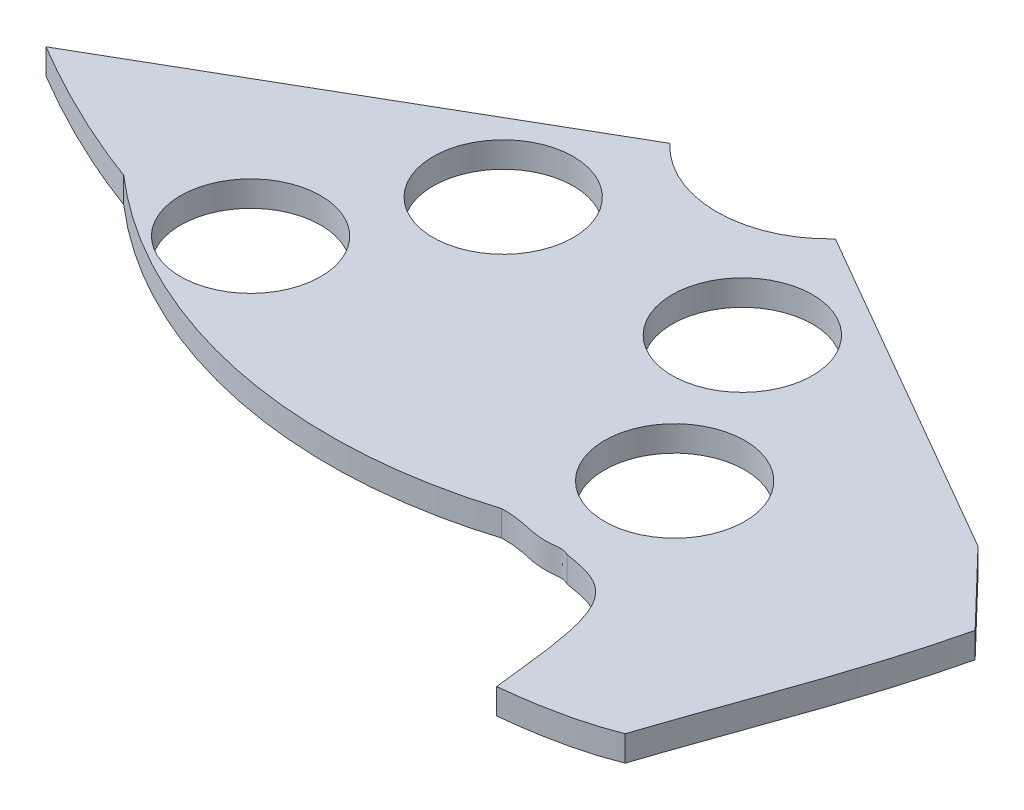
ISO-10303-21;
HEADER;
FILE_DESCRIPTION(('STEP AP214'),'2;1');
FILE_NAME('part.step','',(''),(''),'','','');
FILE_SCHEMA(('AUTOMOTIVE_DESIGN { 1 0 10303 214 1 1 1 1 }'));
ENDSEC;
DATA;
#1=APPLICATION_CONTEXT('core data for automotive mechanical design processes');
#2=APPLICATION_PROTOCOL_DEFINITION('international standard','automotive_design',2000,#1);
#3=PRODUCT_CONTEXT('',#1,'mechanical');
#4=PRODUCT('Part','Part','',(#3));
#5=PRODUCT_RELATED_PRODUCT_CATEGORY('part','',(#4));
#6=PRODUCT_DEFINITION_FORMATION('','',#4);
#7=PRODUCT_DEFINITION_CONTEXT('part definition',#1,'design');
#8=PRODUCT_DEFINITION('design','',#6,#7);
#9=PRODUCT_DEFINITION_SHAPE('','',#8);
#10=(LENGTH_UNIT() NAMED_UNIT(*) SI_UNIT(.MILLI.,.METRE.));
#11=(NAMED_UNIT(*) PLANE_ANGLE_UNIT() SI_UNIT($,.RADIAN.));
#12=(NAMED_UNIT(*) SI_UNIT($,.STERADIAN.) SOLID_ANGLE_UNIT());
#13=UNCERTAINTY_MEASURE_WITH_UNIT(LENGTH_MEASURE(1.E-05),#10,'distance_accuracy_value','');
#14=(GEOMETRIC_REPRESENTATION_CONTEXT(3) GLOBAL_UNCERTAINTY_ASSIGNED_CONTEXT((#13)) GLOBAL_UNIT_ASSIGNED_CONTEXT((#10,
#11,#12)) REPRESENTATION_CONTEXT('',''));
#15=CARTESIAN_POINT('',(0.,0.,0.));
#16=DIRECTION('',(0.,0.,1.));
#17=DIRECTION('',(1.,0.,0.));
#18=AXIS2_PLACEMENT_3D('',#15,#16,#17);
#19=CARTESIAN_POINT('',(0.,-43.7359999999999,0.));
#20=DIRECTION('',(0.,-1.,0.));
#21=DIRECTION('',(0.,0.,-1.));
#22=AXIS2_PLACEMENT_3D('',#19,#20,#21);
#23=PLANE('',#22);
#24=CARTESIAN_POINT('',(18.75,-43.7359999999999,32.476));
#25=DIRECTION('',(0.,-1.,0.));
#26=DIRECTION('',(0.,0.,-1.));
#27=AXIS2_PLACEMENT_3D('',#24,#25,#26);
#28=CIRCLE('',#27,10.999845998306);
#29=CARTESIAN_POINT('',(18.75,-43.7359999999999,21.476154001694));
#30=VERTEX_POINT('',#29);
#31=EDGE_CURVE('E395',#30,#30,#28,.T.);
#32=ORIENTED_EDGE('',*,*,#31,.F.);
#33=EDGE_LOOP('',(#32));
#34=FACE_BOUND('',#33,.T.);
#35=CARTESIAN_POINT('',(-33.25,-43.7359999999999,57.591));
#36=DIRECTION('',(0.,-1.,0.));
#37=DIRECTION('',(0.,0.,-1.));
#38=AXIS2_PLACEMENT_3D('',#35,#36,#37);
#39=CIRCLE('',#38,10.999845998306);
#40=CARTESIAN_POINT('',(-33.25,-43.7359999999999,46.591154001694));
#41=VERTEX_POINT('',#40);
#42=EDGE_CURVE('E184',#41,#41,#39,.T.);
#43=ORIENTED_EDGE('',*,*,#42,.F.);
#44=EDGE_LOOP('',(#43));
#45=FACE_BOUND('',#44,.T.);
#46=CARTESIAN_POINT('',(0.,-43.7359999999999,0.));
#47=DIRECTION('',(0.,1.,0.));
#48=DIRECTION('',(0.,0.,-1.));
#49=AXIS2_PLACEMENT_3D('',#46,#47,#48);
#50=CIRCLE('',#49,17.7501305084715);
#51=CARTESIAN_POINT('',(-12.9766531358799,-43.7359999999999,12.1108879302399));
#52=VERTEX_POINT('',#51);
#53=CARTESIAN_POINT('',(12.9766531358511,-43.7359999999999,12.1108879302707));
#54=VERTEX_POINT('',#53);
#55=EDGE_CURVE('E382',#52,#54,#50,.T.);
#56=ORIENTED_EDGE('',*,*,#55,.T.);
#57=DIRECTION('',(0.866025113442762,0.,0.500000502886197));
#58=VECTOR('',#57,1.);
#59=CARTESIAN_POINT('',(12.9766531358511,-43.7359999999999,12.1108879302707));
#60=LINE('',#59,#58);
#61=CARTESIAN_POINT('',(65.8946490574716,-43.7359999999999,42.6631480920527));
#62=VERTEX_POINT('',#61);
#63=EDGE_CURVE('E99',#54,#62,#60,.T.);
#64=ORIENTED_EDGE('',*,*,#63,.T.);
#65=DIRECTION('',(0.693108334501433,0.,0.720833431969307));
#66=VECTOR('',#65,1.);
#67=CARTESIAN_POINT('',(65.8946490574716,-43.7359999999999,42.6631480920527));
#68=LINE('',#67,#66);
#69=CARTESIAN_POINT('',(77.0984048569557,-43.7359999999999,54.3150664746204));
#70=VERTEX_POINT('',#69);
#71=EDGE_CURVE('E376',#62,#70,#68,.T.);
#72=ORIENTED_EDGE('',*,*,#71,.T.);
#73=CARTESIAN_POINT('',(63.7069100064156,-43.7359999999999,95.7945524473434));
#74=CARTESIAN_POINT('',(64.015107612092,-43.7359999999999,94.8574661245503));
#75=CARTESIAN_POINT('',(64.6302710481504,-43.7359999999999,92.9870387377193));
#76=CARTESIAN_POINT('',(65.7081083485375,-43.7359999999999,89.8467531430533));
#77=CARTESIAN_POINT('',(66.9234172120382,-43.7359999999999,86.3862466294311));
#78=CARTESIAN_POINT('',(68.7339451101139,-43.7359999999999,81.299646281765));
#79=CARTESIAN_POINT('',(70.973500177216,-43.7359999999999,74.9803086793586));
#80=CARTESIAN_POINT('',(73.1008593021126,-43.7359999999999,68.6072949940735));
#81=CARTESIAN_POINT('',(74.6646595645997,-43.7359999999999,63.5032415774842));
#82=CARTESIAN_POINT('',(75.4987469677565,-43.7359999999999,60.5708213525043));
#83=CARTESIAN_POINT('',(76.0346970582517,-43.7359999999999,58.5741590522036));
#84=CARTESIAN_POINT('',(76.3126412633934,-43.7359999999999,57.5107075403805));
#85=CARTESIAN_POINT('',(76.5828114238156,-43.7359999999999,56.4464599434171));
#86=CARTESIAN_POINT('',(76.8456969776299,-43.7359999999999,55.3815868382954));
#87=CARTESIAN_POINT('',(77.0141989671998,-43.7359999999999,54.6704463559508));
#88=CARTESIAN_POINT('',(77.0984048569557,-43.7359999999999,54.3150664746204));
#89=B_SPLINE_CURVE_WITH_KNOTS('',3,(#73,#74,#75,#76,#77,#78,#79,#80,#81,#82,#83,#84,#85,#86,#87,
#88),.UNSPECIFIED.,.F.,.F.,(4,1,1,1,1,1,1,1,1,1,1,1,1,4),(0.,0.0678624264260967,
0.135453626668924,0.228399086259461,0.320178258423042,0.506887549948629,0.689623560844155,
0.782324482215271,0.874107435390033,0.899339348726902,0.924544740953175,0.949723388572744,
0.974875152453978,1.),.UNSPECIFIED.);
#90=CARTESIAN_POINT('',(63.7069100063629,-43.7359999999999,95.7945524473647));
#91=VERTEX_POINT('',#90);
#92=EDGE_CURVE('E261',#70,#91,#89,.F.);
#93=ORIENTED_EDGE('',*,*,#92,.T.);
#94=CARTESIAN_POINT('',(-878.9098124133,-43.7359999999999,-1666.19623544953));
#95=CARTESIAN_POINT('',(1253.73109242407,-43.7359999999999,1934.69867430787));
#96=CARTESIAN_POINT('',(-1017.51914521483,-43.7359999999999,-1797.32532520752));
#97=CARTESIAN_POINT('',(226.982326293528,-43.7359999999999,2054.37229430913));
#98=B_SPLINE_CURVE_WITH_KNOTS('',3,(#94,#95,#96,#97),.UNSPECIFIED.,.F.,.F.,(4,4),
(-15.3310318488955,21.0495799457119),.UNSPECIFIED.);
#99=CARTESIAN_POINT('',(47.2193607498537,-43.7359999999999,99.4676209764198));
#100=VERTEX_POINT('',#99);
#101=EDGE_CURVE('E257',#91,#100,#98,.T.);
#102=ORIENTED_EDGE('',*,*,#101,.T.);
#103=CARTESIAN_POINT('',(34.7613348490512,-43.7359999999999,76.0169271980795));
#104=CARTESIAN_POINT('',(35.0281057972164,-43.7359999999999,76.0543747060179));
#105=CARTESIAN_POINT('',(35.7061558254564,-43.7359999999999,76.1540447682622));
#106=CARTESIAN_POINT('',(36.7442002754335,-43.7359999999999,76.3347608072393));
#107=CARTESIAN_POINT('',(37.914484612396,-43.7359999999999,76.5966844103583));
#108=CARTESIAN_POINT('',(39.0266307741556,-43.7359999999999,76.9320880805245));
#109=CARTESIAN_POINT('',(40.130080769675,-43.7359999999999,77.3933604653864));
#110=CARTESIAN_POINT('',(41.1420644497732,-43.7359999999999,77.987120956502));
#111=CARTESIAN_POINT('',(42.0521871249464,-43.7359999999999,78.7358646406187));
#112=CARTESIAN_POINT('',(42.8337549280017,-43.7359999999999,79.6206387973766));
#113=CARTESIAN_POINT('',(43.4752967929125,-43.7359999999999,80.5945227262676));
#114=CARTESIAN_POINT('',(44.0156145895162,-43.7359999999999,81.6597507216393));
#115=CARTESIAN_POINT('',(44.5984939154484,-43.7359999999999,83.1102141014957));
#116=CARTESIAN_POINT('',(45.1475423889094,-43.7359999999999,84.9887489422292));
#117=CARTESIAN_POINT('',(45.631650409809,-43.7359999999999,87.2480359791229));
#118=CARTESIAN_POINT('',(46.0146669762717,-43.7359999999999,89.5214778155936));
#119=CARTESIAN_POINT('',(46.3255569316779,-43.7359999999999,91.7311363169831));
#120=CARTESIAN_POINT('',(46.6100223162015,-43.7359999999999,94.0205069777494));
#121=CARTESIAN_POINT('',(46.8734678088274,-43.7359999999999,96.313603012262));
#122=CARTESIAN_POINT('',(47.078814588451,-43.7359999999999,98.1789577369324));
#123=CARTESIAN_POINT('',(47.1908123385781,-43.7359999999999,99.2058615104236));
#124=CARTESIAN_POINT('',(47.2193607498537,-43.7359999999999,99.4676209764198));
#125=B_SPLINE_CURVE_WITH_KNOTS('',3,(#103,#104,#105,#106,#107,#108,#109,#110,#111,#112,#113,
#114,#115,#116,#117,#118,#119,#120,#121,#122,#123,#124),.UNSPECIFIED.,.F.,.F.,(4,1,1,1,1,1,1,1,
1,1,1,1,1,1,1,1,1,1,1,4),(0.,0.0255150972310009,0.064910698530786,0.0997702289098735,
0.139050770842425,0.174778284912275,0.212810271676901,0.249753080614974,0.285920016532127,
0.3242135902118,0.359890863091441,0.398887197886508,0.472121187593369,0.544915101377225,
0.617655893238202,0.690440729915689,0.756254769905276,0.836160594182994,0.909062389474332,
0.93400243649382),.UNSPECIFIED.);
#126=CARTESIAN_POINT('',(34.7613348490562,-43.7359999999999,76.0169271980802));
#127=VERTEX_POINT('',#126);
#128=EDGE_CURVE('E260',#100,#127,#125,.F.);
#129=ORIENTED_EDGE('',*,*,#128,.T.);
#130=CARTESIAN_POINT('',(23.4360137790917,-43.7359999999999,74.920133487089));
#131=CARTESIAN_POINT('',(23.5289220972387,-43.7359999999999,74.9171179384482));
#132=CARTESIAN_POINT('',(23.7031334177712,-43.7359999999999,74.9114635178176));
#133=CARTESIAN_POINT('',(24.0745660087652,-43.7359999999999,74.9067751371668));
#134=CARTESIAN_POINT('',(24.746410223038,-43.7359999999999,74.9166710575145));
#135=CARTESIAN_POINT('',(25.7293670437363,-43.7359999999999,74.9931287989677));
#136=CARTESIAN_POINT('',(26.7027297891214,-43.7359999999999,75.1507404125561));
#137=CARTESIAN_POINT('',(27.4770255049856,-43.7359999999999,75.3067964759693));
#138=CARTESIAN_POINT('',(28.2510283346333,-43.7359999999999,75.4716797149084));
#139=CARTESIAN_POINT('',(29.2205562389775,-43.7359999999999,75.6704454421777));
#140=CARTESIAN_POINT('',(30.3976353608172,-43.7359999999999,75.8242359044292));
#141=CARTESIAN_POINT('',(31.3861905119862,-43.7359999999999,75.8486681276571));
#142=CARTESIAN_POINT('',(32.0580687542244,-43.7359999999999,75.8116987684063));
#143=CARTESIAN_POINT('',(33.1015648406731,-43.7359999999999,75.7177235764243));
#144=CARTESIAN_POINT('',(33.9376122073635,-43.7359999999999,75.5350653444208));
#145=CARTESIAN_POINT('',(34.7613348490562,-43.7359999999999,76.0169271980802));
#146=B_SPLINE_CURVE_WITH_KNOTS('',3,(#130,#131,#132,#133,#134,#135,#136,#137,#138,#139,#140,
#141,#142,#143,#144,#145),.UNSPECIFIED.,.F.,.F.,(4,1,1,1,1,1,1,1,1,1,1,1,1,4),
(-0.558775639678511,-0.528884705320353,-0.502727491887882,-0.43933374059014,-0.312868930889388,
-0.186118290639527,-0.122516659736032,-0.0588785171490542,0.06836414522575,0.19564947290242,
0.322302975720156,0.385664646745479,0.411949250743797,0.659179527858723),.UNSPECIFIED.);
#147=CARTESIAN_POINT('',(23.4360137790822,-43.7359999999999,74.9201334867979));
#148=VERTEX_POINT('',#147);
#149=EDGE_CURVE('E126',#127,#148,#146,.F.);
#150=ORIENTED_EDGE('',*,*,#149,.T.);
#151=CARTESIAN_POINT('',(-51.4793037783487,-43.7359999999999,59.2633752899055));
#152=CARTESIAN_POINT('',(-46.450558361626,-43.7359999999999,63.6323878302044));
#153=CARTESIAN_POINT('',(-40.8620638720612,-43.7359999999999,67.3577029668113));
#154=CARTESIAN_POINT('',(-31.911032097336,-43.7359999999999,71.7982583634298));
#155=CARTESIAN_POINT('',(-28.8312879138068,-43.7359999999999,73.0898248517847));
#156=CARTESIAN_POINT('',(-22.5377976505084,-43.7359999999999,75.2692209924342));
#157=CARTESIAN_POINT('',(-19.3201485350809,-43.7359999999999,76.1579569850181));
#158=CARTESIAN_POINT('',(-12.7984413491846,-43.7359999999999,77.5208283134062));
#159=CARTESIAN_POINT('',(-9.49504459754206,-43.7359999999999,77.994503056289));
#160=CARTESIAN_POINT('',(-2.85341060421483,-43.7359999999999,78.5180241448934));
#161=CARTESIAN_POINT('',(0.484671997273886,-43.7359999999999,78.5685450744223));
#162=CARTESIAN_POINT('',(10.465486946096,-43.7359999999999,78.084384220312));
#163=CARTESIAN_POINT('',(17.077323108012,-43.7359999999999,76.9089360329751));
#164=CARTESIAN_POINT('',(23.4360137790829,-43.7359999999999,74.9201334867976));
#165=B_SPLINE_CURVE_WITH_KNOTS('',3,(#151,#152,#153,#154,#155,#156,#157,#158,#159,#160,#161,
#162,#163,#164),.UNSPECIFIED.,.F.,.F.,(4,2,2,2,2,2,4),(1.95125185398215E-06,0.250001708895345,
0.375001708895345,0.500001708895345,0.625001708895345,0.750001708895345,0.999999757643491),.UNSPECIFIED.);
#166=CARTESIAN_POINT('',(-51.4793037783487,-43.7359999999999,59.2633752899055));
#167=VERTEX_POINT('',#166);
#168=EDGE_CURVE('E118',#148,#167,#165,.F.);
#169=ORIENTED_EDGE('',*,*,#168,.T.);
#170=CARTESIAN_POINT('',(-75.002894934144,-43.7359999999999,47.9218092964541));
#171=CARTESIAN_POINT('',(-74.6846944225105,-43.7359999999999,48.1103397399704));
#172=CARTESIAN_POINT('',(-74.0452261887512,-43.7359999999999,48.4892179168355));
#173=CARTESIAN_POINT('',(-72.7157609221368,-43.7359999999999,49.2615174102555));
#174=CARTESIAN_POINT('',(-70.9743246365965,-43.7359999999999,50.2491383850664));
#175=CARTESIAN_POINT('',(-68.3200885524436,-43.7359999999999,51.6992570308515));
#176=CARTESIAN_POINT('',(-65.5387416476642,-43.7359999999999,53.1419154775372));
#177=CARTESIAN_POINT('',(-62.6110106080694,-43.7359999999999,54.57482951308));
#178=CARTESIAN_POINT('',(-60.1645428098585,-43.7359999999999,55.7123049880886));
#179=CARTESIAN_POINT('',(-57.7898815815549,-43.7359999999999,56.759863159789));
#180=CARTESIAN_POINT('',(-55.9429746054121,-43.7359999999999,57.5338186528733));
#181=CARTESIAN_POINT('',(-54.5210793712798,-43.7359999999999,58.1059685059899));
#182=CARTESIAN_POINT('',(-53.5025806185307,-43.7359999999999,58.5048252418427));
#183=CARTESIAN_POINT('',(-52.4900815758763,-43.7359999999999,58.8913038071282));
#184=CARTESIAN_POINT('',(-51.8151874310052,-43.7359999999999,59.1397351298325));
#185=CARTESIAN_POINT('',(-51.4793037783487,-43.7359999999999,59.2633752899055));
#186=B_SPLINE_CURVE_WITH_KNOTS('',3,(#170,#171,#172,#173,#174,#175,#176,#177,#178,#179,#180,
#181,#182,#183,#184,#185),.UNSPECIFIED.,.F.,.F.,(4,1,1,1,1,1,1,1,1,1,1,1,1,4),(0.,
0.0424279174565392,0.0852648077111791,0.176372419889922,0.272076677952541,0.432210072124021,
0.535747247808841,0.645978219223007,0.741682329760795,0.833467376577204,0.875680696096618,
0.917501862653237,0.958942041622421,1.),.UNSPECIFIED.);
#187=CARTESIAN_POINT('',(-75.002894934144,-43.7359999999999,47.9218092964541));
#188=VERTEX_POINT('',#187);
#189=EDGE_CURVE('E123',#167,#188,#186,.F.);
#190=ORIENTED_EDGE('',*,*,#189,.T.);
#191=DIRECTION('',(0.866025077508167,0.,-0.500000565126655));
#192=VECTOR('',#191,1.);
#193=CARTESIAN_POINT('',(-75.002894934144,-43.7359999999999,47.9218092964541));
#194=LINE('',#193,#192);
#195=EDGE_CURVE('E49',#188,#52,#194,.T.);
#196=ORIENTED_EDGE('',*,*,#195,.T.);
#197=EDGE_LOOP('',(#56,#64,#72,#93,#102,#129,#150,#169,#190,#196));
#198=FACE_BOUND('',#197,.T.);
#199=CARTESIAN_POINT('',(33.25,-43.7359999999999,57.591));
#200=DIRECTION('',(0.,-1.,0.));
#201=DIRECTION('',(0.,0.,-1.));
#202=AXIS2_PLACEMENT_3D('',#199,#200,#201);
#203=CIRCLE('',#202,10.999845998306);
#204=CARTESIAN_POINT('',(33.25,-43.7359999999999,46.591154001694));
#205=VERTEX_POINT('',#204);
#206=EDGE_CURVE('E389',#205,#205,#203,.T.);
#207=ORIENTED_EDGE('',*,*,#206,.F.);
#208=EDGE_LOOP('',(#207));
#209=FACE_BOUND('',#208,.T.);
#210=CARTESIAN_POINT('',(-18.75,-43.7359999999999,32.476));
#211=DIRECTION('',(0.,-1.,0.));
#212=DIRECTION('',(0.,0.,-1.));
#213=AXIS2_PLACEMENT_3D('',#210,#211,#212);
#214=CIRCLE('',#213,10.999845998306);
#215=CARTESIAN_POINT('',(-18.75,-43.7359999999999,21.476154001694));
#216=VERTEX_POINT('',#215);
#217=EDGE_CURVE('E401',#216,#216,#214,.T.);
#218=ORIENTED_EDGE('',*,*,#217,.F.);
#219=EDGE_LOOP('',(#218));
#220=FACE_BOUND('',#219,.T.);
#221=ADVANCED_FACE('F30',(#34,#45,#198,#209,#220),#23,.T.);
#222=CARTESIAN_POINT('',(0.,-39.7359999999999,0.));
#223=DIRECTION('',(0.,-1.,0.));
#224=DIRECTION('',(0.,0.,-1.));
#225=AXIS2_PLACEMENT_3D('',#222,#223,#224);
#226=PLANE('',#225);
#227=CARTESIAN_POINT('',(18.75,-39.7359999999999,32.476));
#228=DIRECTION('',(0.,-1.,0.));
#229=DIRECTION('',(0.,0.,-1.));
#230=AXIS2_PLACEMENT_3D('',#227,#228,#229);
#231=CIRCLE('',#230,10.999845998306);
#232=CARTESIAN_POINT('',(18.75,-39.7359999999999,21.476154001694));
#233=VERTEX_POINT('',#232);
#234=EDGE_CURVE('E398',#233,#233,#231,.T.);
#235=ORIENTED_EDGE('',*,*,#234,.T.);
#236=EDGE_LOOP('',(#235));
#237=FACE_BOUND('',#236,.T.);
#238=CARTESIAN_POINT('',(-33.25,-39.7359999999999,57.591));
#239=DIRECTION('',(0.,-1.,0.));
#240=DIRECTION('',(0.,0.,-1.));
#241=AXIS2_PLACEMENT_3D('',#238,#239,#240);
#242=CIRCLE('',#241,10.999845998306);
#243=CARTESIAN_POINT('',(-33.25,-39.7359999999999,46.591154001694));
#244=VERTEX_POINT('',#243);
#245=EDGE_CURVE('E386',#244,#244,#242,.T.);
#246=ORIENTED_EDGE('',*,*,#245,.T.);
#247=EDGE_LOOP('',(#246));
#248=FACE_BOUND('',#247,.T.);
#249=CARTESIAN_POINT('',(0.,-39.7359999999999,0.));
#250=DIRECTION('',(0.,1.,0.));
#251=DIRECTION('',(0.,0.,-1.));
#252=AXIS2_PLACEMENT_3D('',#249,#250,#251);
#253=CIRCLE('',#252,17.7501305084715);
#254=CARTESIAN_POINT('',(-12.9766531358799,-39.7359999999999,12.1108879302399));
#255=VERTEX_POINT('',#254);
#256=CARTESIAN_POINT('',(12.9766531358511,-39.7359999999999,12.1108879302707));
#257=VERTEX_POINT('',#256);
#258=EDGE_CURVE('E177',#255,#257,#253,.T.);
#259=ORIENTED_EDGE('',*,*,#258,.F.);
#260=DIRECTION('',(0.866025077508167,0.,-0.500000565126655));
#261=VECTOR('',#260,1.);
#262=CARTESIAN_POINT('',(-75.002894934144,-39.7359999999999,47.9218092964541));
#263=LINE('',#262,#261);
#264=CARTESIAN_POINT('',(-75.002894934144,-39.7359999999999,47.9218092964541));
#265=VERTEX_POINT('',#264);
#266=EDGE_CURVE('E91',#265,#255,#263,.T.);
#267=ORIENTED_EDGE('',*,*,#266,.F.);
#268=CARTESIAN_POINT('',(-51.4793037783487,-39.7359999999999,59.2633752899055));
#269=CARTESIAN_POINT('',(-51.8151874310052,-39.7359999999999,59.1397351298325));
#270=CARTESIAN_POINT('',(-52.4900815758763,-39.7359999999999,58.8913038071282));
#271=CARTESIAN_POINT('',(-53.5025806185307,-39.7359999999999,58.5048252418427));
#272=CARTESIAN_POINT('',(-54.5210793712798,-39.7359999999999,58.1059685059899));
#273=CARTESIAN_POINT('',(-55.9429746054121,-39.7359999999999,57.5338186528733));
#274=CARTESIAN_POINT('',(-57.7898815815549,-39.7359999999999,56.759863159789));
#275=CARTESIAN_POINT('',(-60.1645428098585,-39.7359999999999,55.7123049880886));
#276=CARTESIAN_POINT('',(-62.6110106080694,-39.7359999999999,54.57482951308));
#277=CARTESIAN_POINT('',(-65.5387416476642,-39.7359999999999,53.1419154775372));
#278=CARTESIAN_POINT('',(-68.3200885524436,-39.7359999999999,51.6992570308515));
#279=CARTESIAN_POINT('',(-70.9743246365965,-39.7359999999999,50.2491383850664));
#280=CARTESIAN_POINT('',(-72.7157609221368,-39.7359999999999,49.2615174102555));
#281=CARTESIAN_POINT('',(-74.0452261887512,-39.7359999999999,48.4892179168355));
#282=CARTESIAN_POINT('',(-74.6846944225105,-39.7359999999999,48.1103397399704));
#283=CARTESIAN_POINT('',(-75.002894934144,-39.7359999999999,47.9218092964541));
#284=B_SPLINE_CURVE_WITH_KNOTS('',3,(#268,#269,#270,#271,#272,#273,#274,#275,#276,#277,#278,
#279,#280,#281,#282,#283),.UNSPECIFIED.,.F.,.F.,(4,1,1,1,1,1,1,1,1,1,1,1,1,4),(0.,
0.0410579583775794,0.0824981373467628,0.124319303903382,0.166532623422796,0.258317670239205,
0.354021780776992,0.464252752191159,0.567789927875979,0.727923322047459,0.823627580110078,
0.914735192288821,0.957572082543461,1.),.UNSPECIFIED.);
#285=CARTESIAN_POINT('',(-51.4793037783487,-39.7359999999999,59.2633752899055));
#286=VERTEX_POINT('',#285);
#287=EDGE_CURVE('E84',#286,#265,#284,.T.);
#288=ORIENTED_EDGE('',*,*,#287,.F.);
#289=CARTESIAN_POINT('',(23.4360137790829,-39.7359999999999,74.9201334867976));
#290=CARTESIAN_POINT('',(17.077323108012,-39.7359999999999,76.9089360329751));
#291=CARTESIAN_POINT('',(10.465486946096,-39.7359999999999,78.084384220312));
#292=CARTESIAN_POINT('',(0.484671997273886,-39.7359999999999,78.5685450744223));
#293=CARTESIAN_POINT('',(-2.85341060421483,-39.7359999999999,78.5180241448934));
#294=CARTESIAN_POINT('',(-9.49504459754206,-39.7359999999999,77.994503056289));
#295=CARTESIAN_POINT('',(-12.7984413491846,-39.7359999999999,77.5208283134062));
#296=CARTESIAN_POINT('',(-19.3201485350809,-39.7359999999999,76.1579569850181));
#297=CARTESIAN_POINT('',(-22.5377976505084,-39.7359999999999,75.2692209924342));
#298=CARTESIAN_POINT('',(-28.8312879138068,-39.7359999999999,73.0898248517847));
#299=CARTESIAN_POINT('',(-31.911032097336,-39.7359999999999,71.7982583634298));
#300=CARTESIAN_POINT('',(-40.8620638720612,-39.7359999999999,67.3577029668113));
#301=CARTESIAN_POINT('',(-46.450558361626,-39.7359999999999,63.6323878302044));
#302=CARTESIAN_POINT('',(-51.4793037783487,-39.7359999999999,59.2633752899055));
#303=B_SPLINE_CURVE_WITH_KNOTS('',3,(#289,#290,#291,#292,#293,#294,#295,#296,#297,#298,#299,
#300,#301,#302),.UNSPECIFIED.,.F.,.F.,(4,2,2,2,2,2,4),(1.95125185394278E-06,0.25,0.375,0.5,
0.625,0.75,0.999999757643491),.UNSPECIFIED.);
#304=CARTESIAN_POINT('',(23.4360137790822,-39.7359999999999,74.9201334867979));
#305=VERTEX_POINT('',#304);
#306=EDGE_CURVE('E137',#305,#286,#303,.T.);
#307=ORIENTED_EDGE('',*,*,#306,.F.);
#308=CARTESIAN_POINT('',(34.7613348490562,-39.7359999999999,76.0169271980802));
#309=CARTESIAN_POINT('',(33.9376122073635,-39.7359999999999,75.5350653444208));
#310=CARTESIAN_POINT('',(33.1015648406731,-39.7359999999999,75.7177235764243));
#311=CARTESIAN_POINT('',(32.0580687542244,-39.7359999999999,75.8116987684063));
#312=CARTESIAN_POINT('',(31.3861905119862,-39.7359999999999,75.8486681276571));
#313=CARTESIAN_POINT('',(30.3976353608172,-39.7359999999999,75.8242359044292));
#314=CARTESIAN_POINT('',(29.2205562389775,-39.7359999999999,75.6704454421777));
#315=CARTESIAN_POINT('',(28.2510283346333,-39.7359999999999,75.4716797149084));
#316=CARTESIAN_POINT('',(27.4770255049856,-39.7359999999999,75.3067964759693));
#317=CARTESIAN_POINT('',(26.7027297891214,-39.7359999999999,75.1507404125561));
#318=CARTESIAN_POINT('',(25.7293670437363,-39.7359999999999,74.9931287989677));
#319=CARTESIAN_POINT('',(24.746410223038,-39.7359999999999,74.9166710575145));
#320=CARTESIAN_POINT('',(24.0745660087652,-39.7359999999999,74.9067751371668));
#321=CARTESIAN_POINT('',(23.7031334177712,-39.7359999999999,74.9114635178176));
#322=CARTESIAN_POINT('',(23.5289220972387,-39.7359999999999,74.9171179384482));
#323=CARTESIAN_POINT('',(23.4360137790917,-39.7359999999999,74.920133487089));
#324=B_SPLINE_CURVE_WITH_KNOTS('',3,(#308,#309,#310,#311,#312,#313,#314,#315,#316,#317,#318,
#319,#320,#321,#322,#323),.UNSPECIFIED.,.F.,.F.,(4,1,1,1,1,1,1,1,1,1,1,1,1,4),
(-0.558775639678511,-0.311545362563585,-0.285260758565267,-0.221899087539944,
-0.0952455847222082,0.0320397429544621,0.159282405329266,0.222920547916244,0.286522178819739,
0.4132728190696,0.539737628770352,0.603131380068094,0.629288593500565,0.659179527858723),.UNSPECIFIED.);
#325=CARTESIAN_POINT('',(34.7613348490562,-39.7359999999999,76.0169271980802));
#326=VERTEX_POINT('',#325);
#327=EDGE_CURVE('E319',#326,#305,#324,.T.);
#328=ORIENTED_EDGE('',*,*,#327,.F.);
#329=CARTESIAN_POINT('',(47.2193607498537,-39.736,99.4676209764198));
#330=CARTESIAN_POINT('',(47.1908123385781,-39.736,99.2058615104236));
#331=CARTESIAN_POINT('',(47.078814588451,-39.736,98.1789577369324));
#332=CARTESIAN_POINT('',(46.8734678088274,-39.736,96.313603012262));
#333=CARTESIAN_POINT('',(46.6100223162015,-39.736,94.0205069777494));
#334=CARTESIAN_POINT('',(46.3255569316779,-39.736,91.7311363169831));
#335=CARTESIAN_POINT('',(46.0146669762717,-39.736,89.5214778155936));
#336=CARTESIAN_POINT('',(45.631650409809,-39.736,87.2480359791229));
#337=CARTESIAN_POINT('',(45.1475423889094,-39.736,84.9887489422292));
#338=CARTESIAN_POINT('',(44.5984939154484,-39.736,83.1102141014957));
#339=CARTESIAN_POINT('',(44.0156145895162,-39.736,81.6597507216393));
#340=CARTESIAN_POINT('',(43.4752967929125,-39.736,80.5945227262676));
#341=CARTESIAN_POINT('',(42.8337549280017,-39.736,79.6206387973766));
#342=CARTESIAN_POINT('',(42.0521871249464,-39.736,78.7358646406187));
#343=CARTESIAN_POINT('',(41.1420644497732,-39.736,77.987120956502));
#344=CARTESIAN_POINT('',(40.130080769675,-39.736,77.3933604653864));
#345=CARTESIAN_POINT('',(39.0266307741556,-39.736,76.9320880805245));
#346=CARTESIAN_POINT('',(37.914484612396,-39.736,76.5966844103583));
#347=CARTESIAN_POINT('',(36.7442002754335,-39.736,76.3347608072393));
#348=CARTESIAN_POINT('',(35.7061558254564,-39.736,76.1540447682622));
#349=CARTESIAN_POINT('',(35.0281057972164,-39.736,76.0543747060179));
#350=CARTESIAN_POINT('',(34.7613348490512,-39.736,76.0169271980795));
#351=B_SPLINE_CURVE_WITH_KNOTS('',3,(#329,#330,#331,#332,#333,#334,#335,#336,#337,#338,#339,
#340,#341,#342,#343,#344,#345,#346,#347,#348,#349,#350),.UNSPECIFIED.,.F.,.F.,(4,1,1,1,1,1,1,1,
1,1,1,1,1,1,1,1,1,1,1,4),(0.,0.0249400470194877,0.0978418423108261,0.177747666588544,
0.243561706578131,0.316346543255618,0.389087335116595,0.461881248900451,0.535115238607312,
0.574111573402379,0.60978884628202,0.648082419961693,0.684249355878846,0.721192164816919,
0.759224151581545,0.794951665651395,0.834232207583946,0.869091737963034,0.908487339262819,
0.93400243649382),.UNSPECIFIED.);
#352=CARTESIAN_POINT('',(47.2193607498537,-39.7359999999999,99.4676209764198));
#353=VERTEX_POINT('',#352);
#354=EDGE_CURVE('E274',#353,#326,#351,.T.);
#355=ORIENTED_EDGE('',*,*,#354,.F.);
#356=CARTESIAN_POINT('',(-878.9098124133,-39.7359999999999,-1666.19623544953));
#357=CARTESIAN_POINT('',(1253.73109242407,-39.7359999999999,1934.69867430787));
#358=CARTESIAN_POINT('',(-1017.51914521483,-39.7359999999999,-1797.32532520752));
#359=CARTESIAN_POINT('',(226.982326293528,-39.7359999999999,2054.37229430913));
#360=B_SPLINE_CURVE_WITH_KNOTS('',3,(#356,#357,#358,#359),.UNSPECIFIED.,.F.,.F.,(4,4),
(-15.3310318488955,21.0495799457119),.UNSPECIFIED.);
#361=CARTESIAN_POINT('',(63.7069100063629,-39.7359999999999,95.7945524473647));
#362=VERTEX_POINT('',#361);
#363=EDGE_CURVE('E351',#362,#353,#360,.T.);
#364=ORIENTED_EDGE('',*,*,#363,.F.);
#365=CARTESIAN_POINT('',(77.0984048569557,-39.7359999999999,54.3150664746204));
#366=CARTESIAN_POINT('',(77.0141989671998,-39.7359999999999,54.6704463559508));
#367=CARTESIAN_POINT('',(76.8456969776299,-39.7359999999999,55.3815868382954));
#368=CARTESIAN_POINT('',(76.5828114238156,-39.7359999999999,56.4464599434171));
#369=CARTESIAN_POINT('',(76.3126412633934,-39.7359999999999,57.5107075403805));
#370=CARTESIAN_POINT('',(76.0346970582517,-39.7359999999999,58.5741590522036));
#371=CARTESIAN_POINT('',(75.4987469677565,-39.7359999999999,60.5708213525043));
#372=CARTESIAN_POINT('',(74.6646595645997,-39.7359999999999,63.5032415774842));
#373=CARTESIAN_POINT('',(73.1008593021126,-39.7359999999999,68.6072949940735));
#374=CARTESIAN_POINT('',(70.973500177216,-39.7359999999999,74.9803086793586));
#375=CARTESIAN_POINT('',(68.7339451101139,-39.7359999999999,81.299646281765));
#376=CARTESIAN_POINT('',(66.9234172120382,-39.7359999999999,86.3862466294311));
#377=CARTESIAN_POINT('',(65.7081083485375,-39.7359999999999,89.8467531430533));
#378=CARTESIAN_POINT('',(64.6302710481504,-39.7359999999999,92.9870387377193));
#379=CARTESIAN_POINT('',(64.015107612092,-39.7359999999999,94.8574661245503));
#380=CARTESIAN_POINT('',(63.7069100064156,-39.7359999999999,95.7945524473434));
#381=B_SPLINE_CURVE_WITH_KNOTS('',3,(#365,#366,#367,#368,#369,#370,#371,#372,#373,#374,#375,
#376,#377,#378,#379,#380),.UNSPECIFIED.,.F.,.F.,(4,1,1,1,1,1,1,1,1,1,1,1,1,4),(0.,
0.0251248475460218,0.0502766114272559,0.0754552590468254,0.100660651273098,0.125892564609967,
0.217675517784729,0.310376439155846,0.493112450051371,0.679821741576958,0.771600913740539,
0.864546373331076,0.932137573573903,1.),.UNSPECIFIED.);
#382=CARTESIAN_POINT('',(77.0984048569557,-39.7359999999999,54.3150664746204));
#383=VERTEX_POINT('',#382);
#384=EDGE_CURVE('E214',#383,#362,#381,.T.);
#385=ORIENTED_EDGE('',*,*,#384,.F.);
#386=DIRECTION('',(0.693108334501433,0.,0.720833431969307));
#387=VECTOR('',#386,1.);
#388=CARTESIAN_POINT('',(65.8946490574716,-39.7359999999999,42.6631480920527));
#389=LINE('',#388,#387);
#390=CARTESIAN_POINT('',(65.8946490574716,-39.7359999999999,42.6631480920527));
#391=VERTEX_POINT('',#390);
#392=EDGE_CURVE('E186',#391,#383,#389,.T.);
#393=ORIENTED_EDGE('',*,*,#392,.F.);
#394=DIRECTION('',(0.866025113442762,0.,0.500000502886197));
#395=VECTOR('',#394,1.);
#396=CARTESIAN_POINT('',(12.9766531358511,-39.7359999999999,12.1108879302707));
#397=LINE('',#396,#395);
#398=EDGE_CURVE('E183',#257,#391,#397,.T.);
#399=ORIENTED_EDGE('',*,*,#398,.F.);
#400=EDGE_LOOP('',(#259,#267,#288,#307,#328,#355,#364,#385,#393,#399));
#401=FACE_BOUND('',#400,.T.);
#402=CARTESIAN_POINT('',(33.25,-39.7359999999999,57.591));
#403=DIRECTION('',(0.,-1.,0.));
#404=DIRECTION('',(0.,0.,-1.));
#405=AXIS2_PLACEMENT_3D('',#402,#403,#404);
#406=CIRCLE('',#405,10.999845998306);
#407=CARTESIAN_POINT('',(33.25,-39.7359999999999,46.591154001694));
#408=VERTEX_POINT('',#407);
#409=EDGE_CURVE('E392',#408,#408,#406,.T.);
#410=ORIENTED_EDGE('',*,*,#409,.T.);
#411=EDGE_LOOP('',(#410));
#412=FACE_BOUND('',#411,.T.);
#413=CARTESIAN_POINT('',(-18.75,-39.7359999999999,32.476));
#414=DIRECTION('',(0.,-1.,0.));
#415=DIRECTION('',(0.,0.,-1.));
#416=AXIS2_PLACEMENT_3D('',#413,#414,#415);
#417=CIRCLE('',#416,10.999845998306);
#418=CARTESIAN_POINT('',(-18.75,-39.7359999999999,21.476154001694));
#419=VERTEX_POINT('',#418);
#420=EDGE_CURVE('E404',#419,#419,#417,.T.);
#421=ORIENTED_EDGE('',*,*,#420,.T.);
#422=EDGE_LOOP('',(#421));
#423=FACE_BOUND('',#422,.T.);
#424=ADVANCED_FACE('F324',(#237,#248,#401,#412,#423),#226,.F.);
#425=CARTESIAN_POINT('',(0.,-43.7359999999999,0.));
#426=DIRECTION('',(0.,1.,0.));
#427=DIRECTION('',(0.,0.,1.));
#428=AXIS2_PLACEMENT_3D('',#425,#426,#427);
#429=CYLINDRICAL_SURFACE('',#428,17.7501305084715);
#430=ORIENTED_EDGE('',*,*,#258,.T.);
#431=DIRECTION('',(0.,1.,0.));
#432=VECTOR('',#431,1.);
#433=CARTESIAN_POINT('',(12.9766531358511,-43.7359999999999,12.1108879302707));
#434=LINE('',#433,#432);
#435=EDGE_CURVE('E11',#54,#257,#434,.T.);
#436=ORIENTED_EDGE('',*,*,#435,.F.);
#437=ORIENTED_EDGE('',*,*,#55,.F.);
#438=DIRECTION('',(0.,1.,0.));
#439=VECTOR('',#438,1.);
#440=CARTESIAN_POINT('',(-12.9766531358799,-43.7359999999999,12.1108879302399));
#441=LINE('',#440,#439);
#442=EDGE_CURVE('E187',#52,#255,#441,.T.);
#443=ORIENTED_EDGE('',*,*,#442,.T.);
#444=EDGE_LOOP('',(#430,#436,#437,#443));
#445=FACE_BOUND('',#444,.T.);
#446=ADVANCED_FACE('F32',(#445),#429,.F.);
#447=CARTESIAN_POINT('',(12.9766531358511,-43.7359999999999,12.1108879302707));
#448=DIRECTION('',(-0.500000502886198,0.,0.866025113442763));
#449=DIRECTION('',(0.866025113442763,0.,0.500000502886198));
#450=AXIS2_PLACEMENT_3D('',#447,#448,#449);
#451=PLANE('',#450);
#452=ORIENTED_EDGE('',*,*,#398,.T.);
#453=DIRECTION('',(0.,1.,0.));
#454=VECTOR('',#453,1.);
#455=CARTESIAN_POINT('',(65.8946490574716,-43.7359999999999,42.6631480920527));
#456=LINE('',#455,#454);
#457=EDGE_CURVE('E40',#62,#391,#456,.T.);
#458=ORIENTED_EDGE('',*,*,#457,.F.);
#459=ORIENTED_EDGE('',*,*,#63,.F.);
#460=ORIENTED_EDGE('',*,*,#435,.T.);
#461=EDGE_LOOP('',(#452,#458,#459,#460));
#462=FACE_BOUND('',#461,.T.);
#463=ADVANCED_FACE('F523',(#462),#451,.F.);
#464=CARTESIAN_POINT('',(65.8946490574716,-43.7359999999999,42.6631480920527));
#465=DIRECTION('',(-0.720833431969307,0.,0.693108334501433));
#466=DIRECTION('',(0.693108334501433,0.,0.720833431969307));
#467=AXIS2_PLACEMENT_3D('',#464,#465,#466);
#468=PLANE('',#467);
#469=ORIENTED_EDGE('',*,*,#392,.T.);
#470=DIRECTION('',(0.,1.,0.));
#471=VECTOR('',#470,1.);
#472=CARTESIAN_POINT('',(77.0984048569557,-43.7359999999999,54.3150664746204));
#473=LINE('',#472,#471);
#474=EDGE_CURVE('E190',#70,#383,#473,.T.);
#475=ORIENTED_EDGE('',*,*,#474,.F.);
#476=ORIENTED_EDGE('',*,*,#71,.F.);
#477=ORIENTED_EDGE('',*,*,#457,.T.);
#478=EDGE_LOOP('',(#469,#475,#476,#477));
#479=FACE_BOUND('',#478,.T.);
#480=ADVANCED_FACE('F232',(#479),#468,.F.);
#481=CARTESIAN_POINT('',(77.0984048569557,-43.7359999999999,54.3150664746204));
#482=CARTESIAN_POINT('',(77.0141989671998,-43.7359999999999,54.6704463559508));
#483=CARTESIAN_POINT('',(76.8456969776299,-43.7359999999999,55.3815868382954));
#484=CARTESIAN_POINT('',(76.5828114238156,-43.7359999999999,56.4464599434171));
#485=CARTESIAN_POINT('',(76.3126412633934,-43.7359999999999,57.5107075403805));
#486=CARTESIAN_POINT('',(76.0346970582517,-43.7359999999999,58.5741590522036));
#487=CARTESIAN_POINT('',(75.4987469677565,-43.7359999999999,60.5708213525043));
#488=CARTESIAN_POINT('',(74.6646595645997,-43.7359999999999,63.5032415774842));
#489=CARTESIAN_POINT('',(73.1008593021126,-43.7359999999999,68.6072949940735));
#490=CARTESIAN_POINT('',(70.973500177216,-43.7359999999999,74.9803086793586));
#491=CARTESIAN_POINT('',(68.7339451101139,-43.7359999999999,81.299646281765));
#492=CARTESIAN_POINT('',(66.9234172120382,-43.7359999999999,86.3862466294311));
#493=CARTESIAN_POINT('',(65.7081083485375,-43.7359999999999,89.8467531430533));
#494=CARTESIAN_POINT('',(64.6302710481504,-43.7359999999999,92.9870387377193));
#495=CARTESIAN_POINT('',(64.015107612092,-43.7359999999999,94.8574661245503));
#496=CARTESIAN_POINT('',(63.7069100064156,-43.7359999999999,95.7945524473434));
#497=B_SPLINE_CURVE_WITH_KNOTS('',3,(#481,#482,#483,#484,#485,#486,#487,#488,#489,#490,#491,
#492,#493,#494,#495,#496),.UNSPECIFIED.,.F.,.F.,(4,1,1,1,1,1,1,1,1,1,1,1,1,4),(0.,
0.0251248475460218,0.0502766114272559,0.0754552590468254,0.100660651273098,0.125892564609967,
0.217675517784729,0.310376439155846,0.493112450051371,0.679821741576958,0.771600913740539,
0.864546373331076,0.932137573573903,1.),.UNSPECIFIED.);
#498=DIRECTION('',(0.,1.,0.));
#499=VECTOR('',#498,1.);
#500=SURFACE_OF_LINEAR_EXTRUSION('',#497,#499);
#501=ORIENTED_EDGE('',*,*,#384,.T.);
#502=DIRECTION('',(0.,1.,0.));
#503=VECTOR('',#502,1.);
#504=CARTESIAN_POINT('',(63.7069100063629,-43.7359999999999,95.7945524473647));
#505=LINE('',#504,#503);
#506=EDGE_CURVE('E195',#91,#362,#505,.T.);
#507=ORIENTED_EDGE('',*,*,#506,.F.);
#508=ORIENTED_EDGE('',*,*,#92,.F.);
#509=ORIENTED_EDGE('',*,*,#474,.T.);
#510=EDGE_LOOP('',(#501,#507,#508,#509));
#511=FACE_BOUND('',#510,.T.);
#512=ADVANCED_FACE('F220',(#511),#500,.F.);
#513=DIRECTION('',(0.,1.,0.));
#514=VECTOR('',#513,1.);
#515=SURFACE_OF_LINEAR_EXTRUSION('',#98,#514);
#516=ORIENTED_EDGE('',*,*,#363,.T.);
#517=DIRECTION('',(0.,1.,0.));
#518=VECTOR('',#517,1.);
#519=CARTESIAN_POINT('',(47.2193607498537,-43.7359999999999,99.4676209764198));
#520=LINE('',#519,#518);
#521=EDGE_CURVE('E202',#100,#353,#520,.T.);
#522=ORIENTED_EDGE('',*,*,#521,.F.);
#523=ORIENTED_EDGE('',*,*,#101,.F.);
#524=ORIENTED_EDGE('',*,*,#506,.T.);
#525=EDGE_LOOP('',(#516,#522,#523,#524));
#526=FACE_BOUND('',#525,.T.);
#527=ADVANCED_FACE('F231',(#526),#515,.F.);
#528=CARTESIAN_POINT('',(47.2193607498537,-43.7359999999999,99.4676209764198));
#529=CARTESIAN_POINT('',(47.1908123385781,-43.7359999999999,99.2058615104236));
#530=CARTESIAN_POINT('',(47.078814588451,-43.7359999999999,98.1789577369324));
#531=CARTESIAN_POINT('',(46.8734678088274,-43.7359999999999,96.313603012262));
#532=CARTESIAN_POINT('',(46.6100223162015,-43.7359999999999,94.0205069777494));
#533=CARTESIAN_POINT('',(46.3255569316779,-43.7359999999999,91.7311363169831));
#534=CARTESIAN_POINT('',(46.0146669762717,-43.7359999999999,89.5214778155936));
#535=CARTESIAN_POINT('',(45.631650409809,-43.7359999999999,87.2480359791229));
#536=CARTESIAN_POINT('',(45.1475423889094,-43.7359999999999,84.9887489422292));
#537=CARTESIAN_POINT('',(44.5984939154484,-43.7359999999999,83.1102141014957));
#538=CARTESIAN_POINT('',(44.0156145895162,-43.7359999999999,81.6597507216393));
#539=CARTESIAN_POINT('',(43.4752967929125,-43.7359999999999,80.5945227262676));
#540=CARTESIAN_POINT('',(42.8337549280017,-43.7359999999999,79.6206387973766));
#541=CARTESIAN_POINT('',(42.0521871249464,-43.7359999999999,78.7358646406187));
#542=CARTESIAN_POINT('',(41.1420644497732,-43.7359999999999,77.987120956502));
#543=CARTESIAN_POINT('',(40.130080769675,-43.7359999999999,77.3933604653864));
#544=CARTESIAN_POINT('',(39.0266307741556,-43.7359999999999,76.9320880805245));
#545=CARTESIAN_POINT('',(37.914484612396,-43.7359999999999,76.5966844103583));
#546=CARTESIAN_POINT('',(36.7442002754335,-43.7359999999999,76.3347608072393));
#547=CARTESIAN_POINT('',(35.6159879918358,-43.7359999999999,76.1383471998822));
#548=CARTESIAN_POINT('',(34.4278620530489,-43.7359999999999,75.9679775623787));
#549=CARTESIAN_POINT('',(33.4695010420035,-43.7359999999999,75.8452305854596));
#550=CARTESIAN_POINT('',(32.8688236106953,-43.7359999999999,75.7706497617741));
#551=CARTESIAN_POINT('',(32.6883242691306,-43.7359999999999,75.7482387490293));
#552=B_SPLINE_CURVE_WITH_KNOTS('',3,(#528,#529,#530,#531,#532,#533,#534,#535,#536,#537,#538,
#539,#540,#541,#542,#543,#544,#545,#546,#547,#548,#549,#550,#551),.UNSPECIFIED.,.F.,.F.,(4,1,1,
1,1,1,1,1,1,1,1,1,1,1,1,1,1,1,1,1,1,4),(0.,0.0249400470194877,0.0978418423108261,
0.177747666588544,0.243561706578131,0.316346543255618,0.389087335116595,0.461881248900451,
0.535115238607312,0.574111573402379,0.60978884628202,0.648082419961693,0.684249355878846,
0.721192164816919,0.759224151581545,0.794951665651395,0.834232207583946,0.869091737963034,
0.908487339262819,0.942668795049887,0.982772376311745,1.),.UNSPECIFIED.);
#553=DIRECTION('',(0.,1.,0.));
#554=VECTOR('',#553,1.);
#555=SURFACE_OF_LINEAR_EXTRUSION('',#552,#554);
#556=ORIENTED_EDGE('',*,*,#354,.T.);
#557=DIRECTION('',(0.,1.,0.));
#558=VECTOR('',#557,1.);
#559=CARTESIAN_POINT('',(34.7613348490562,-43.7359999999999,76.0169271980802));
#560=LINE('',#559,#558);
#561=EDGE_CURVE('E267',#127,#326,#560,.T.);
#562=ORIENTED_EDGE('',*,*,#561,.F.);
#563=ORIENTED_EDGE('',*,*,#128,.F.);
#564=ORIENTED_EDGE('',*,*,#521,.T.);
#565=EDGE_LOOP('',(#556,#562,#563,#564));
#566=FACE_BOUND('',#565,.T.);
#567=ADVANCED_FACE('F280',(#566),#555,.F.);
#568=CARTESIAN_POINT('',(273.744151401053,-43.7359999999999,2061.01043932376));
#569=CARTESIAN_POINT('',(52.1193121991488,-43.7359999999999,56.3987175717323));
#570=CARTESIAN_POINT('',(43.1036629654178,-43.7359999999999,74.8169544181082));
#571=CARTESIAN_POINT('',(32.0580687542244,-43.7359999999999,75.8116987684063));
#572=CARTESIAN_POINT('',(31.3861905119862,-43.7359999999999,75.8486681276571));
#573=CARTESIAN_POINT('',(30.3976353608172,-43.7359999999999,75.8242359044292));
#574=CARTESIAN_POINT('',(29.2205562389775,-43.7359999999999,75.6704454421777));
#575=CARTESIAN_POINT('',(28.2510283346333,-43.7359999999999,75.4716797149084));
#576=CARTESIAN_POINT('',(27.4770255049856,-43.7359999999999,75.3067964759693));
#577=CARTESIAN_POINT('',(26.7027297891214,-43.7359999999999,75.1507404125561));
#578=CARTESIAN_POINT('',(25.7293670437363,-43.7359999999999,74.9931287989677));
#579=CARTESIAN_POINT('',(24.746410223038,-43.7359999999999,74.9166710575145));
#580=CARTESIAN_POINT('',(24.0745660087652,-43.7359999999999,74.9067751371668));
#581=CARTESIAN_POINT('',(11.9240870038727,-43.7359999999999,75.0601436676771));
#582=CARTESIAN_POINT('',(0.363650256661844,-43.7359999999999,91.4583420267472));
#583=CARTESIAN_POINT('',(-60.2319082676308,-43.7359999999999,-1923.19978364271));
#584=B_SPLINE_CURVE_WITH_KNOTS('',3,(#568,#569,#570,#571,#572,#573,#574,#575,#576,#577,#578,
#579,#580,#581,#582,#583),.UNSPECIFIED.,.F.,.F.,(4,1,1,1,1,1,1,1,1,1,1,1,1,4),
(-3.78779812876404,-0.311545362563585,-0.285260758565267,-0.221899087539944,-0.0952455847222082,
0.0320397429544621,0.159282405329266,0.222920547916244,0.286522178819739,0.4132728190696,
0.539737628770352,0.603131380068094,0.629288593500565,4.44697765661409),.UNSPECIFIED.);
#585=DIRECTION('',(0.,1.,0.));
#586=VECTOR('',#585,1.);
#587=SURFACE_OF_LINEAR_EXTRUSION('',#584,#586);
#588=ORIENTED_EDGE('',*,*,#327,.T.);
#589=DIRECTION('',(0.,1.,0.));
#590=VECTOR('',#589,1.);
#591=CARTESIAN_POINT('',(23.4360137790822,-43.7359999999999,74.9201334867979));
#592=LINE('',#591,#590);
#593=EDGE_CURVE('E139',#148,#305,#592,.T.);
#594=ORIENTED_EDGE('',*,*,#593,.F.);
#595=ORIENTED_EDGE('',*,*,#149,.F.);
#596=ORIENTED_EDGE('',*,*,#561,.T.);
#597=EDGE_LOOP('',(#588,#594,#595,#596));
#598=FACE_BOUND('',#597,.T.);
#599=ADVANCED_FACE('F288',(#598),#587,.F.);
#600=CARTESIAN_POINT('',(23.4361626690822,-43.7359999999999,74.9200869184297));
#601=CARTESIAN_POINT('',(17.0774263196756,-43.7359999999999,76.9089176840163));
#602=CARTESIAN_POINT('',(10.4655388799227,-43.7359999999999,78.0843817010462));
#603=CARTESIAN_POINT('',(0.484671997273886,-43.7359999999999,78.5685450744223));
#604=CARTESIAN_POINT('',(-2.85341060421483,-43.7359999999999,78.5180241448934));
#605=CARTESIAN_POINT('',(-9.49504459754206,-43.7359999999999,77.994503056289));
#606=CARTESIAN_POINT('',(-12.7984413491846,-43.7359999999999,77.5208283134062));
#607=CARTESIAN_POINT('',(-19.3201485350809,-43.7359999999999,76.1579569850181));
#608=CARTESIAN_POINT('',(-22.5377976505084,-43.7359999999999,75.2692209924342));
#609=CARTESIAN_POINT('',(-28.8312879138068,-43.7359999999999,73.0898248517847));
#610=CARTESIAN_POINT('',(-31.911032097336,-43.7359999999999,71.7982583634298));
#611=CARTESIAN_POINT('',(-40.8620696569738,-43.7359999999999,67.3577000969494));
#612=CARTESIAN_POINT('',(-46.4505691969003,-43.7359999999999,63.6323806073617));
#613=CARTESIAN_POINT('',(-51.4793184033515,-43.7359999999999,59.2633625835878));
#614=B_SPLINE_CURVE_WITH_KNOTS('',3,(#600,#601,#602,#603,#604,#605,#606,#607,#608,#609,#610,
#611,#612,#613),.UNSPECIFIED.,.F.,.F.,(4,2,2,2,2,2,4),(0.,0.25,0.375,0.5,0.625,0.75,1.),.UNSPECIFIED.);
#615=DIRECTION('',(0.,1.,0.));
#616=VECTOR('',#615,1.);
#617=SURFACE_OF_LINEAR_EXTRUSION('',#614,#616);
#618=ORIENTED_EDGE('',*,*,#306,.T.);
#619=DIRECTION('',(0.,1.,0.));
#620=VECTOR('',#619,1.);
#621=CARTESIAN_POINT('',(-51.4793037783487,-43.7359999999999,59.2633752899055));
#622=LINE('',#621,#620);
#623=EDGE_CURVE('E134',#167,#286,#622,.T.);
#624=ORIENTED_EDGE('',*,*,#623,.F.);
#625=ORIENTED_EDGE('',*,*,#168,.F.);
#626=ORIENTED_EDGE('',*,*,#593,.T.);
#627=EDGE_LOOP('',(#618,#624,#625,#626));
#628=FACE_BOUND('',#627,.T.);
#629=ADVANCED_FACE('F135',(#628),#617,.F.);
#630=CARTESIAN_POINT('',(-51.4793037783487,-43.7359999999999,59.2633752899055));
#631=CARTESIAN_POINT('',(-51.8151874310052,-43.7359999999999,59.1397351298325));
#632=CARTESIAN_POINT('',(-52.4900815758763,-43.7359999999999,58.8913038071282));
#633=CARTESIAN_POINT('',(-53.5025806185307,-43.7359999999999,58.5048252418427));
#634=CARTESIAN_POINT('',(-54.5210793712798,-43.7359999999999,58.1059685059899));
#635=CARTESIAN_POINT('',(-55.9429746054121,-43.7359999999999,57.5338186528733));
#636=CARTESIAN_POINT('',(-57.7898815815549,-43.7359999999999,56.759863159789));
#637=CARTESIAN_POINT('',(-60.1645428098585,-43.7359999999999,55.7123049880886));
#638=CARTESIAN_POINT('',(-62.6110106080694,-43.7359999999999,54.57482951308));
#639=CARTESIAN_POINT('',(-65.5387416476642,-43.7359999999999,53.1419154775372));
#640=CARTESIAN_POINT('',(-68.3200885524436,-43.7359999999999,51.6992570308515));
#641=CARTESIAN_POINT('',(-70.9743246365965,-43.7359999999999,50.2491383850664));
#642=CARTESIAN_POINT('',(-72.7157609221368,-43.7359999999999,49.2615174102555));
#643=CARTESIAN_POINT('',(-74.0452261887512,-43.7359999999999,48.4892179168355));
#644=CARTESIAN_POINT('',(-74.6846944225105,-43.7359999999999,48.1103397399704));
#645=CARTESIAN_POINT('',(-75.002894934144,-43.7359999999999,47.9218092964541));
#646=B_SPLINE_CURVE_WITH_KNOTS('',3,(#630,#631,#632,#633,#634,#635,#636,#637,#638,#639,#640,
#641,#642,#643,#644,#645),.UNSPECIFIED.,.F.,.F.,(4,1,1,1,1,1,1,1,1,1,1,1,1,4),(0.,
0.0410579583775794,0.0824981373467628,0.124319303903382,0.166532623422796,0.258317670239205,
0.354021780776992,0.464252752191159,0.567789927875979,0.727923322047459,0.823627580110078,
0.914735192288821,0.957572082543461,1.),.UNSPECIFIED.);
#647=DIRECTION('',(0.,1.,0.));
#648=VECTOR('',#647,1.);
#649=SURFACE_OF_LINEAR_EXTRUSION('',#646,#648);
#650=ORIENTED_EDGE('',*,*,#287,.T.);
#651=DIRECTION('',(0.,1.,0.));
#652=VECTOR('',#651,1.);
#653=CARTESIAN_POINT('',(-75.002894934144,-43.7359999999999,47.9218092964541));
#654=LINE('',#653,#652);
#655=EDGE_CURVE('E140',#188,#265,#654,.T.);
#656=ORIENTED_EDGE('',*,*,#655,.F.);
#657=ORIENTED_EDGE('',*,*,#189,.F.);
#658=ORIENTED_EDGE('',*,*,#623,.T.);
#659=EDGE_LOOP('',(#650,#656,#657,#658));
#660=FACE_BOUND('',#659,.T.);
#661=ADVANCED_FACE('F143',(#660),#649,.F.);
#662=CARTESIAN_POINT('',(-75.002894934144,-43.7359999999999,47.9218092964541));
#663=DIRECTION('',(0.500000565126655,0.,0.866025077508167));
#664=DIRECTION('',(0.866025077508167,0.,-0.500000565126655));
#665=AXIS2_PLACEMENT_3D('',#662,#663,#664);
#666=PLANE('',#665);
#667=ORIENTED_EDGE('',*,*,#266,.T.);
#668=ORIENTED_EDGE('',*,*,#442,.F.);
#669=ORIENTED_EDGE('',*,*,#195,.F.);
#670=ORIENTED_EDGE('',*,*,#655,.T.);
#671=EDGE_LOOP('',(#667,#668,#669,#670));
#672=FACE_BOUND('',#671,.T.);
#673=ADVANCED_FACE('F163',(#672),#666,.F.);
#674=CARTESIAN_POINT('',(-33.25,-43.7359999999999,57.591));
#675=DIRECTION('',(0.,1.,0.));
#676=DIRECTION('',(0.,0.,1.));
#677=AXIS2_PLACEMENT_3D('',#674,#675,#676);
#678=CYLINDRICAL_SURFACE('',#677,10.999845998306);
#679=ORIENTED_EDGE('',*,*,#42,.T.);
#680=EDGE_LOOP('',(#679));
#681=FACE_BOUND('',#680,.T.);
#682=ORIENTED_EDGE('',*,*,#245,.F.);
#683=EDGE_LOOP('',(#682));
#684=FACE_BOUND('',#683,.T.);
#685=ADVANCED_FACE('F421',(#681,#684),#678,.F.);
#686=CARTESIAN_POINT('',(33.25,-43.7359999999999,57.591));
#687=DIRECTION('',(0.,1.,0.));
#688=DIRECTION('',(0.,0.,1.));
#689=AXIS2_PLACEMENT_3D('',#686,#687,#688);
#690=CYLINDRICAL_SURFACE('',#689,10.999845998306);
#691=ORIENTED_EDGE('',*,*,#206,.T.);
#692=EDGE_LOOP('',(#691));
#693=FACE_BOUND('',#692,.T.);
#694=ORIENTED_EDGE('',*,*,#409,.F.);
#695=EDGE_LOOP('',(#694));
#696=FACE_BOUND('',#695,.T.);
#697=ADVANCED_FACE('F424',(#693,#696),#690,.F.);
#698=CARTESIAN_POINT('',(18.75,-43.7359999999999,32.476));
#699=DIRECTION('',(0.,1.,0.));
#700=DIRECTION('',(0.,0.,1.));
#701=AXIS2_PLACEMENT_3D('',#698,#699,#700);
#702=CYLINDRICAL_SURFACE('',#701,10.999845998306);
#703=ORIENTED_EDGE('',*,*,#31,.T.);
#704=EDGE_LOOP('',(#703));
#705=FACE_BOUND('',#704,.T.);
#706=ORIENTED_EDGE('',*,*,#234,.F.);
#707=EDGE_LOOP('',(#706));
#708=FACE_BOUND('',#707,.T.);
#709=ADVANCED_FACE('F433',(#705,#708),#702,.F.);
#710=CARTESIAN_POINT('',(-18.75,-43.7359999999999,32.476));
#711=DIRECTION('',(0.,1.,0.));
#712=DIRECTION('',(0.,0.,1.));
#713=AXIS2_PLACEMENT_3D('',#710,#711,#712);
#714=CYLINDRICAL_SURFACE('',#713,10.999845998306);
#715=ORIENTED_EDGE('',*,*,#217,.T.);
#716=EDGE_LOOP('',(#715));
#717=FACE_BOUND('',#716,.T.);
#718=ORIENTED_EDGE('',*,*,#420,.F.);
#719=EDGE_LOOP('',(#718));
#720=FACE_BOUND('',#719,.T.);
#721=ADVANCED_FACE('F410',(#717,#720),#714,.F.);
#722=CLOSED_SHELL('',(#221,#424,#446,#463,#480,#512,#527,#567,#599,#629,#661,#673,#685,#697,
#709,#721));
#723=MANIFOLD_SOLID_BREP('B2',#722);
#724=ADVANCED_BREP_SHAPE_REPRESENTATION('',(#18,#723),#14);
#725=SHAPE_DEFINITION_REPRESENTATION(#9,#724);
ENDSEC;
END-ISO-10303-21;
